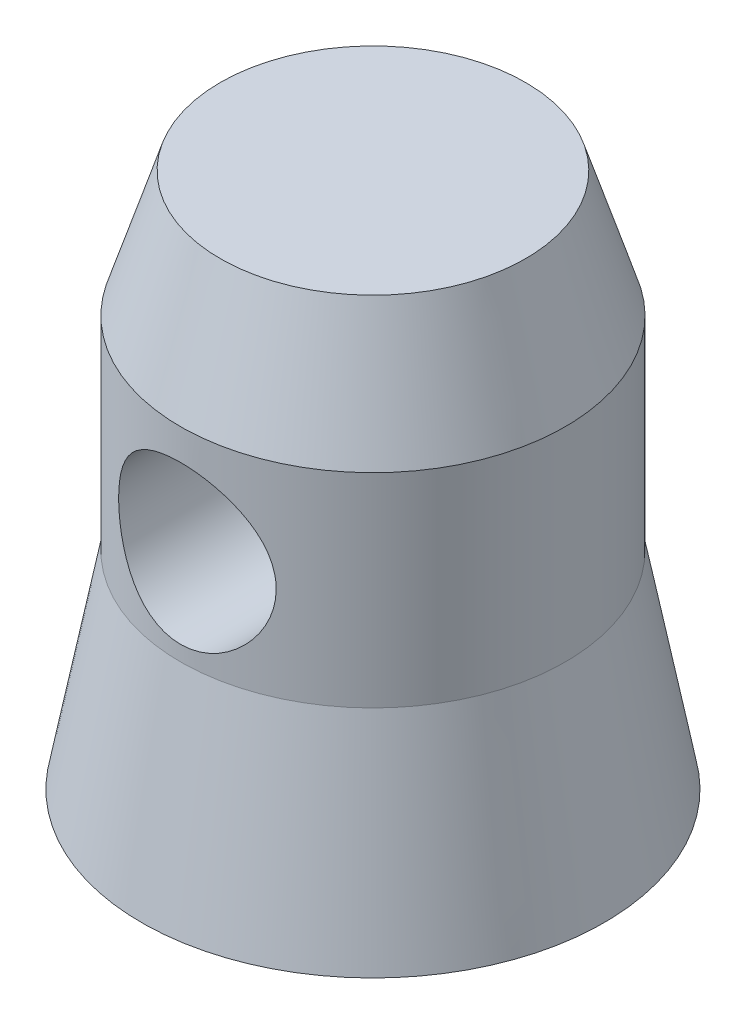
ISO-10303-21;
HEADER;
FILE_DESCRIPTION(('STEP AP214'),'2;1');
FILE_NAME('part.step','',(''),(''),'','','');
FILE_SCHEMA(('AUTOMOTIVE_DESIGN { 1 0 10303 214 1 1 1 1 }'));
ENDSEC;
DATA;
#1=APPLICATION_CONTEXT('core data for automotive mechanical design processes');
#2=APPLICATION_PROTOCOL_DEFINITION('international standard','automotive_design',2000,#1);
#3=PRODUCT_CONTEXT('',#1,'mechanical');
#4=PRODUCT('Part','Part','',(#3));
#5=PRODUCT_RELATED_PRODUCT_CATEGORY('part','',(#4));
#6=PRODUCT_DEFINITION_FORMATION('','',#4);
#7=PRODUCT_DEFINITION_CONTEXT('part definition',#1,'design');
#8=PRODUCT_DEFINITION('design','',#6,#7);
#9=PRODUCT_DEFINITION_SHAPE('','',#8);
#10=(LENGTH_UNIT() NAMED_UNIT(*) SI_UNIT(.MILLI.,.METRE.));
#11=(NAMED_UNIT(*) PLANE_ANGLE_UNIT() SI_UNIT($,.RADIAN.));
#12=(NAMED_UNIT(*) SI_UNIT($,.STERADIAN.) SOLID_ANGLE_UNIT());
#13=UNCERTAINTY_MEASURE_WITH_UNIT(LENGTH_MEASURE(1.E-05),#10,'distance_accuracy_value','');
#14=(GEOMETRIC_REPRESENTATION_CONTEXT(3) GLOBAL_UNCERTAINTY_ASSIGNED_CONTEXT((#13)) GLOBAL_UNIT_ASSIGNED_CONTEXT((#10,
#11,#12)) REPRESENTATION_CONTEXT('',''));
#15=CARTESIAN_POINT('',(0.,0.,0.));
#16=DIRECTION('',(0.,0.,1.));
#17=DIRECTION('',(1.,0.,0.));
#18=AXIS2_PLACEMENT_3D('',#15,#16,#17);
#19=CARTESIAN_POINT('',(0.,40.0685,0.));
#20=DIRECTION('',(0.,-1.,0.));
#21=DIRECTION('',(1.,0.,0.));
#22=AXIS2_PLACEMENT_3D('',#19,#20,#21);
#23=PLANE('',#22);
#24=CARTESIAN_POINT('',(0.,40.0685,0.));
#25=DIRECTION('',(0.,1.,0.));
#26=DIRECTION('',(-1.,0.,0.));
#27=AXIS2_PLACEMENT_3D('',#24,#25,#26);
#28=CIRCLE('',#27,11.4173);
#29=CARTESIAN_POINT('',(-11.4173,40.0685,0.));
#30=VERTEX_POINT('',#29);
#31=EDGE_CURVE('E11',#30,#30,#28,.T.);
#32=ORIENTED_EDGE('',*,*,#31,.T.);
#33=EDGE_LOOP('',(#32));
#34=FACE_BOUND('',#33,.T.);
#35=ADVANCED_FACE('F47',(#34),#23,.F.);
#36=CARTESIAN_POINT('',(0.,30.6720447215452,0.));
#37=DIRECTION('',(0.,-1.,0.));
#38=DIRECTION('',(1.,0.,0.));
#39=AXIS2_PLACEMENT_3D('',#36,#37,#38);
#40=CONICAL_SURFACE('',#39,14.3891,0.306314127170361);
#41=ORIENTED_EDGE('',*,*,#31,.F.);
#42=EDGE_LOOP('',(#41));
#43=FACE_BOUND('',#42,.T.);
#44=CARTESIAN_POINT('',(0.,30.6720447215452,0.));
#45=DIRECTION('',(0.,1.,0.));
#46=DIRECTION('',(-1.,0.,0.));
#47=AXIS2_PLACEMENT_3D('',#44,#45,#46);
#48=CIRCLE('',#47,14.3891);
#49=CARTESIAN_POINT('',(-14.3891,30.6720447215452,0.));
#50=VERTEX_POINT('',#49);
#51=EDGE_CURVE('E58',#50,#50,#48,.T.);
#52=ORIENTED_EDGE('',*,*,#51,.T.);
#53=EDGE_LOOP('',(#52));
#54=FACE_BOUND('',#53,.T.);
#55=ADVANCED_FACE('F124',(#43,#54),#40,.T.);
#56=CARTESIAN_POINT('',(0.,40.0685,0.));
#57=DIRECTION('',(0.,1.,0.));
#58=DIRECTION('',(-1.,0.,0.));
#59=AXIS2_PLACEMENT_3D('',#56,#57,#58);
#60=CYLINDRICAL_SURFACE('',#59,14.3891);
#61=CARTESIAN_POINT('',(5.8928,22.4663,-13.1271134287017));
#62=CARTESIAN_POINT('',(5.89279897874006,22.6237977590066,-13.1271144674701));
#63=CARTESIAN_POINT('',(5.88647659392604,22.7813546515966,-13.1299576705593));
#64=CARTESIAN_POINT('',(5.86124986328871,23.0953271641315,-13.1412379308711));
#65=CARTESIAN_POINT('',(5.84233712473644,23.2517419523897,-13.1496787194296));
#66=CARTESIAN_POINT('',(5.79208054789978,23.5625309397312,-13.1718926746865));
#67=CARTESIAN_POINT('',(5.76070983588906,23.7168999769915,-13.1856773674516));
#68=CARTESIAN_POINT('',(5.68585688768558,24.0222063232181,-13.218127386555));
#69=CARTESIAN_POINT('',(5.64236956222136,24.1731421612805,-13.2367947635369));
#70=CARTESIAN_POINT('',(5.54392401418745,24.4698761356427,-13.2783260424639));
#71=CARTESIAN_POINT('',(5.48901755488484,24.6156940999038,-13.301170952964));
#72=CARTESIAN_POINT('',(5.36809429326873,24.9020438153663,-13.3504315796775));
#73=CARTESIAN_POINT('',(5.30207325611212,25.0425735265878,-13.3768486561892));
#74=CARTESIAN_POINT('',(5.08816355167638,25.4548359260035,-13.4603200744783));
#75=CARTESIAN_POINT('',(4.92430031291323,25.7176244855872,-13.5216512402519));
#76=CARTESIAN_POINT('',(4.54842116235066,26.2269807447127,-13.6528303643214));
#77=CARTESIAN_POINT('',(4.33426886665973,26.4718856687491,-13.7229602449378));
#78=CARTESIAN_POINT('',(3.86811196170328,26.9236521172067,-13.8615597586649));
#79=CARTESIAN_POINT('',(3.61609310908583,27.1304992609418,-13.9300287557371));
#80=CARTESIAN_POINT('',(3.20860337444701,27.4118877473419,-14.0275369775021));
#81=CARTESIAN_POINT('',(3.06464820169486,27.5023721853536,-14.059764528099));
#82=CARTESIAN_POINT('',(2.76894612825238,27.6708110297492,-14.1209730859291));
#83=CARTESIAN_POINT('',(2.61720223883541,27.7487702312049,-14.1499553342767));
#84=CARTESIAN_POINT('',(2.30694460953794,27.8914506613595,-14.2038375879663));
#85=CARTESIAN_POINT('',(2.14843172412335,27.9561735549718,-14.2287381066457));
#86=CARTESIAN_POINT('',(1.82576253096758,28.0717474130809,-14.2737280193694));
#87=CARTESIAN_POINT('',(1.66160660410328,28.1225993117382,-14.2938177373924));
#88=CARTESIAN_POINT('',(1.33733712308195,28.2076661870287,-14.3276986878065));
#89=CARTESIAN_POINT('',(1.17743748542428,28.2425911085459,-14.3417565614498));
#90=CARTESIAN_POINT('',(0.854922548216011,28.2990519206722,-14.3645895650561));
#91=CARTESIAN_POINT('',(0.692307418320001,28.3205886445398,-14.3733650237865));
#92=CARTESIAN_POINT('',(0.365695506854969,28.3500263994732,-14.3853801689324));
#93=CARTESIAN_POINT('',(0.201699180130914,28.3579317556633,-14.3886216112438));
#94=CARTESIAN_POINT('',(-0.126393036505877,28.3600276510301,-14.3894798588847));
#95=CARTESIAN_POINT('',(-0.29048892249047,28.354218700074,-14.3870968733177));
#96=CARTESIAN_POINT('',(-0.607777541247382,28.3297036947262,-14.3770823248087));
#97=CARTESIAN_POINT('',(-0.761041562102387,28.3117800407666,-14.3697692321592));
#98=CARTESIAN_POINT('',(-1.06545101062447,28.2640279468903,-14.3504104351718));
#99=CARTESIAN_POINT('',(-1.2165957325397,28.2341956343398,-14.3383631913323));
#100=CARTESIAN_POINT('',(-1.5156399084112,28.1629259765132,-14.309842400858));
#101=CARTESIAN_POINT('',(-1.66354040567466,28.1214924228677,-14.2933703004691));
#102=CARTESIAN_POINT('',(-1.95525491186343,28.0273764672751,-14.256395297471));
#103=CARTESIAN_POINT('',(-2.09906734358139,27.9746897887745,-14.235890862679));
#104=CARTESIAN_POINT('',(-2.38378528701974,27.8576535375889,-14.1910124470272));
#105=CARTESIAN_POINT('',(-2.52461641667137,27.7931430935489,-14.1665857524366));
#106=CARTESIAN_POINT('',(-2.80034789900867,27.6535009625869,-14.1146721811044));
#107=CARTESIAN_POINT('',(-2.93524605906735,27.5783653915035,-14.0871841860465));
#108=CARTESIAN_POINT('',(-3.32987786004749,27.3378314750322,-14.0010863607578));
#109=CARTESIAN_POINT('',(-3.57973273860891,27.157229822858,-13.9388124343545));
#110=CARTESIAN_POINT('',(-4.06373718416454,26.7463331127313,-13.8057807995121));
#111=CARTESIAN_POINT('',(-4.2956428254531,26.5134836202349,-13.7347341532062));
#112=CARTESIAN_POINT('',(-4.61230715497607,26.1376286061915,-13.6303061868417));
#113=CARTESIAN_POINT('',(-4.7127219241535,26.0078138250705,-13.595830613028));
#114=CARTESIAN_POINT('',(-4.90254614795691,25.7399888339733,-13.5285387834214));
#115=CARTESIAN_POINT('',(-4.99195963277403,25.6019816528184,-13.4957219225899));
#116=CARTESIAN_POINT('',(-5.16178459850035,25.3140849434917,-13.4317042783109));
#117=CARTESIAN_POINT('',(-5.24182588928257,25.1639585182669,-13.4005864371167));
#118=CARTESIAN_POINT('',(-5.38884035780674,24.856794635144,-13.342145853835));
#119=CARTESIAN_POINT('',(-5.4558188680402,24.6997600295247,-13.3148215644607));
#120=CARTESIAN_POINT('',(-5.5760732186576,24.379853878295,-13.2649104173362));
#121=CARTESIAN_POINT('',(-5.62935376978751,24.2169843613312,-13.2423219314313));
#122=CARTESIAN_POINT('',(-5.72164932842111,23.886592779194,-13.2027064086404));
#123=CARTESIAN_POINT('',(-5.76066555290651,23.7190711122383,-13.185678897325));
#124=CARTESIAN_POINT('',(-5.82195394018541,23.3914662584902,-13.1587270727792));
#125=CARTESIAN_POINT('',(-5.84512934049359,23.2315830745074,-13.1484214918916));
#126=CARTESIAN_POINT('',(-5.87827753150692,22.9101896485193,-13.1336356302616));
#127=CARTESIAN_POINT('',(-5.88825116257274,22.7486795107374,-13.1291549787326));
#128=CARTESIAN_POINT('',(-5.894875183698,22.4253762182869,-13.1261821691301));
#129=CARTESIAN_POINT('',(-5.89152922253223,22.2635831532613,-13.1276883710151));
#130=CARTESIAN_POINT('',(-5.87156305729931,21.9409870559544,-13.1366306809222));
#131=CARTESIAN_POINT('',(-5.85494322217848,21.7801839962811,-13.1440666241275));
#132=CARTESIAN_POINT('',(-5.81004943780193,21.4706281287923,-13.1639691209823));
#133=CARTESIAN_POINT('',(-5.78255115456426,21.3217402273062,-13.1760998698263));
#134=CARTESIAN_POINT('',(-5.71629730843592,21.0268993652605,-13.2049781837515));
#135=CARTESIAN_POINT('',(-5.67753811560554,20.8809473673322,-13.2217272374484));
#136=CARTESIAN_POINT('',(-5.58913070043093,20.5929619626042,-13.2593408893447));
#137=CARTESIAN_POINT('',(-5.53948455809045,20.4509278131085,-13.2802047013234));
#138=CARTESIAN_POINT('',(-5.42969130138583,20.1715041705872,-13.3254709376194));
#139=CARTESIAN_POINT('',(-5.36954015244679,20.0341164863799,-13.3498747208935));
#140=CARTESIAN_POINT('',(-5.23650570925004,19.7592037393904,-13.4026316028628));
#141=CARTESIAN_POINT('',(-5.16319971530535,19.6219065668573,-13.4311060487853));
#142=CARTESIAN_POINT('',(-5.00619479390646,19.3538668719287,-13.490413420901));
#143=CARTESIAN_POINT('',(-4.92249231278401,19.2231266123344,-13.5212471521412));
#144=CARTESIAN_POINT('',(-4.74522318937274,18.9688766536814,-13.5844731336045));
#145=CARTESIAN_POINT('',(-4.65165464222894,18.8453683580936,-13.6168656841322));
#146=CARTESIAN_POINT('',(-4.45519596624789,18.6062130377939,-13.6824029367633));
#147=CARTESIAN_POINT('',(-4.35230544701814,18.4905663426712,-13.7155476703235));
#148=CARTESIAN_POINT('',(-4.12932310877077,18.2589724272248,-13.7843950404704));
#149=CARTESIAN_POINT('',(-4.00851512705125,18.1437125343416,-13.8200944817895));
#150=CARTESIAN_POINT('',(-3.75742736584696,17.9237588958497,-13.8904618540291));
#151=CARTESIAN_POINT('',(-3.62715057089775,17.8190618455058,-13.9251301051632));
#152=CARTESIAN_POINT('',(-3.35777430844079,17.6208466607573,-13.9925277420118));
#153=CARTESIAN_POINT('',(-3.21867064336072,17.5273339068948,-14.0252561907373));
#154=CARTESIAN_POINT('',(-2.93258735915395,17.3522868156427,-14.0878514324703));
#155=CARTESIAN_POINT('',(-2.78561116899951,17.2707473201361,-14.1177194558178));
#156=CARTESIAN_POINT('',(-2.48438574021267,17.1201497804061,-14.1738327793914));
#157=CARTESIAN_POINT('',(-2.33012389380604,17.0511144527569,-14.2000714660974));
#158=CARTESIAN_POINT('',(-2.01569690067295,16.9263858676603,-14.2481031127985));
#159=CARTESIAN_POINT('',(-1.855534277246,16.8706869819484,-14.2698979476158));
#160=CARTESIAN_POINT('',(-1.53047645693846,16.7731886137106,-14.3084107252352));
#161=CARTESIAN_POINT('',(-1.3655824787735,16.7313855861518,-14.3251299628005));
#162=CARTESIAN_POINT('',(-1.03234627389794,16.6621371085381,-14.3529929349494));
#163=CARTESIAN_POINT('',(-0.864004295477814,16.6346906284193,-14.3641370695371));
#164=CARTESIAN_POINT('',(-0.536810281873367,16.5958488876108,-14.379951807336));
#165=CARTESIAN_POINT('',(-0.378090767768421,16.5834895862737,-14.3850108669896));
#166=CARTESIAN_POINT('',(-0.0600937874123246,16.5716590062336,-14.3898529821406));
#167=CARTESIAN_POINT('',(0.0991836565164839,16.572187217669,-14.3896362463614));
#168=CARTESIAN_POINT('',(0.417052134245705,16.5861243550575,-14.3839331507322));
#169=CARTESIAN_POINT('',(0.575643270174842,16.5995312933462,-14.3784476040549));
#170=CARTESIAN_POINT('',(0.890964897994285,16.6390776069023,-14.3623571119075));
#171=CARTESIAN_POINT('',(1.04769539941291,16.6652169169382,-14.3517521926653));
#172=CARTESIAN_POINT('',(1.35291988388054,16.7288631665642,-14.326146415148));
#173=CARTESIAN_POINT('',(1.50151356821077,16.7659580549584,-14.3113054620701));
#174=CARTESIAN_POINT('',(1.79497709534298,16.8514523015618,-14.2774675886987));
#175=CARTESIAN_POINT('',(1.93984569798198,16.8998553717833,-14.2584693038536));
#176=CARTESIAN_POINT('',(2.22489359576222,17.0075319782358,-14.2167785767382));
#177=CARTESIAN_POINT('',(2.36507390708796,17.066803140521,-14.1940869413375));
#178=CARTESIAN_POINT('',(2.64003589999877,17.1957807777726,-14.1455261658417));
#179=CARTESIAN_POINT('',(2.77481550158297,17.2654912252248,-14.1196558168188));
#180=CARTESIAN_POINT('',(3.04407024630984,17.4181585209749,-14.0641231993747));
#181=CARTESIAN_POINT('',(3.17826536697984,17.5015665475037,-14.0343434716007));
#182=CARTESIAN_POINT('',(3.43924781556282,17.6786549403873,-13.9726791213882));
#183=CARTESIAN_POINT('',(3.56603256443059,17.7723388508278,-13.9407937742535));
#184=CARTESIAN_POINT('',(3.8115076473749,17.9693815512226,-13.8756886718278));
#185=CARTESIAN_POINT('',(3.9301968828755,18.0727416497558,-13.8424687363988));
#186=CARTESIAN_POINT('',(4.1588576194439,18.2885361291012,-13.7754962954337));
#187=CARTESIAN_POINT('',(4.26882882521347,18.4009708170288,-13.7417437719042));
#188=CARTESIAN_POINT('',(4.48639101046234,18.6419777934361,-13.6723214783539));
#189=CARTESIAN_POINT('',(4.59335254659409,18.7711248660925,-13.6366711944123));
#190=CARTESIAN_POINT('',(4.7960060577798,19.0382516809205,-13.5667245538861));
#191=CARTESIAN_POINT('',(4.89170176503533,19.176228474422,-13.5324277514306));
#192=CARTESIAN_POINT('',(5.07128653853164,19.4604020650839,-13.4661584952345));
#193=CARTESIAN_POINT('',(5.1551636599196,19.6066069724188,-13.4341884086191));
#194=CARTESIAN_POINT('',(5.31029273994916,19.9061600310143,-13.3736279437617));
#195=CARTESIAN_POINT('',(5.38155043710141,20.0595048952051,-13.34503603132));
#196=CARTESIAN_POINT('',(5.51040039436107,20.3713425824934,-13.2923475204956));
#197=CARTESIAN_POINT('',(5.56808175203269,20.5297936118153,-13.2682218482917));
#198=CARTESIAN_POINT('',(5.66977797382079,20.8516268440425,-13.2250849296009));
#199=CARTESIAN_POINT('',(5.71379949724637,21.0150066013823,-13.2060711915995));
#200=CARTESIAN_POINT('',(5.78760876916713,21.3450507993446,-13.1738909600977));
#201=CARTESIAN_POINT('',(5.81743415609117,21.5117053205625,-13.1607090113141));
#202=CARTESIAN_POINT('',(5.86263481951639,21.8472504592646,-13.1406366570643));
#203=CARTESIAN_POINT('',(5.87802143548286,22.0161392162005,-13.1337413145434));
#204=CARTESIAN_POINT('',(5.88833299385925,22.2321539294826,-13.1291177883749));
#205=CARTESIAN_POINT('',(5.89000768833123,22.2789625929936,-13.128366597292));
#206=CARTESIAN_POINT('',(5.89224134657752,22.372612426996,-13.1273642614929));
#207=CARTESIAN_POINT('',(5.8928003037653,22.4194535976775,-13.1271131197286));
#208=CARTESIAN_POINT('',(5.8928,22.4663,-13.1271134287017));
#209=B_SPLINE_CURVE_WITH_KNOTS('',3,(#61,#62,#63,#64,#65,#66,#67,#68,#69,#70,#71,#72,#73,#74,
#75,#76,#77,#78,#79,#80,#81,#82,#83,#84,#85,#86,#87,#88,#89,#90,#91,#92,#93,#94,#95,#96,#97,#98,
#99,#100,#101,#102,#103,#104,#105,#106,#107,#108,#109,#110,#111,#112,#113,#114,#115,#116,#117,
#118,#119,#120,#121,#122,#123,#124,#125,#126,#127,#128,#129,#130,#131,#132,#133,#134,#135,#136,
#137,#138,#139,#140,#141,#142,#143,#144,#145,#146,#147,#148,#149,#150,#151,#152,#153,#154,#155,
#156,#157,#158,#159,#160,#161,#162,#163,#164,#165,#166,#167,#168,#169,#170,#171,#172,#173,#174,
#175,#176,#177,#178,#179,#180,#181,#182,#183,#184,#185,#186,#187,#188,#189,#190,#191,#192,#193,
#194,#195,#196,#197,#198,#199,#200,#201,#202,#203,#204,#205,#206,#207,#208),.UNSPECIFIED.,.T.,
.F.,(4,2,2,2,2,2,2,2,2,2,2,2,2,2,2,2,2,2,2,2,2,2,2,2,2,2,2,2,2,2,2,2,2,2,2,2,2,2,2,2,2,2,2,2,2,
2,2,2,2,2,2,2,2,2,2,2,2,2,2,2,2,2,2,2,2,2,2,2,2,2,2,2,2,4),(0.,0.472444266950458,
0.945203780993147,1.41898869691307,1.89297291476015,2.3648536343754,2.83691455718319,
3.77982826199668,4.77409273358314,5.76873213433177,6.28736019160087,6.80578922546094,
7.3241530091735,7.84248187437296,8.33465922168688,8.8268059336553,9.31879646264159,
9.81076870081658,10.2736692891879,10.7367205332132,11.199620614618,11.6626969271185,
12.1326176495582,12.6027106042108,13.5422993844652,14.5461696229486,15.0488050412728,
15.5512557732816,16.0694617654615,16.587455770633,17.1052713979796,17.6230428368202,
18.1080537232633,18.5930337347778,19.0778808998038,19.5627145890083,20.0178698813722,
20.4731720555524,20.9283873177454,21.3837777968939,21.857944321366,22.3322733710947,
22.8066941684592,23.2811348431629,23.7927732434907,24.304251070821,24.8159739785347,
25.3274757835527,25.8398977222151,26.3521030251618,26.8641775567181,27.3762153425383,
27.8534565766906,28.3306789300423,28.8078276421463,29.2849739097145,29.7460666650567,
30.2073109914392,30.6684546867743,31.1297743102275,31.6116067770604,32.0936059504507,
32.575670402409,33.0577511759462,33.571458020331,34.0849941994984,34.5990457345545,
35.1128629080932,35.623207667964,36.1333032372254,36.6420387433847,37.1503743797451,
37.2908981795228,37.4314228088515),.UNSPECIFIED.);
#210=CARTESIAN_POINT('',(5.8928,22.4663,-13.1271134287017));
#211=VERTEX_POINT('',#210);
#212=EDGE_CURVE('E50',#211,#211,#209,.T.);
#213=ORIENTED_EDGE('',*,*,#212,.T.);
#214=EDGE_LOOP('',(#213));
#215=FACE_BOUND('',#214,.T.);
#216=CARTESIAN_POINT('',(5.8928,22.4663,13.1271134287017));
#217=CARTESIAN_POINT('',(5.89279897874006,22.3088022409934,13.1271144674701));
#218=CARTESIAN_POINT('',(5.88647659392604,22.1512453484034,13.1299576705593));
#219=CARTESIAN_POINT('',(5.86124986328871,21.8372728358685,13.1412379308711));
#220=CARTESIAN_POINT('',(5.84233712473644,21.6808580476103,13.1496787194296));
#221=CARTESIAN_POINT('',(5.79208054789978,21.3700690602688,13.1718926746865));
#222=CARTESIAN_POINT('',(5.76070983588906,21.2157000230085,13.1856773674516));
#223=CARTESIAN_POINT('',(5.68585688768558,20.9103936767819,13.218127386555));
#224=CARTESIAN_POINT('',(5.64236956222136,20.7594578387195,13.2367947635369));
#225=CARTESIAN_POINT('',(5.54392401418745,20.4627238643573,13.2783260424639));
#226=CARTESIAN_POINT('',(5.48901755488484,20.3169059000962,13.301170952964));
#227=CARTESIAN_POINT('',(5.36809429326873,20.0305561846337,13.3504315796775));
#228=CARTESIAN_POINT('',(5.30207325611212,19.8900264734122,13.3768486561892));
#229=CARTESIAN_POINT('',(5.08816355167638,19.4777640739965,13.4603200744783));
#230=CARTESIAN_POINT('',(4.92430031291323,19.2149755144127,13.5216512402519));
#231=CARTESIAN_POINT('',(4.54842116235066,18.7056192552873,13.6528303643214));
#232=CARTESIAN_POINT('',(4.33426886665973,18.4607143312509,13.7229602449378));
#233=CARTESIAN_POINT('',(3.86811196170328,18.0089478827933,13.8615597586649));
#234=CARTESIAN_POINT('',(3.61609310908583,17.8021007390582,13.9300287557371));
#235=CARTESIAN_POINT('',(3.20860337444701,17.5207122526581,14.0275369775021));
#236=CARTESIAN_POINT('',(3.06464820169486,17.4302278146464,14.059764528099));
#237=CARTESIAN_POINT('',(2.76894612825238,17.2617889702508,14.1209730859291));
#238=CARTESIAN_POINT('',(2.61720223883541,17.1838297687951,14.1499553342767));
#239=CARTESIAN_POINT('',(2.30694460953794,17.0411493386405,14.2038375879663));
#240=CARTESIAN_POINT('',(2.14843172412335,16.9764264450282,14.2287381066457));
#241=CARTESIAN_POINT('',(1.82576253096758,16.8608525869191,14.2737280193694));
#242=CARTESIAN_POINT('',(1.66160660410328,16.8100006882618,14.2938177373924));
#243=CARTESIAN_POINT('',(1.33733712308195,16.7249338129713,14.3276986878065));
#244=CARTESIAN_POINT('',(1.17743748542428,16.6900088914541,14.3417565614498));
#245=CARTESIAN_POINT('',(0.854922548216011,16.6335480793278,14.3645895650561));
#246=CARTESIAN_POINT('',(0.692307418320001,16.6120113554601,14.3733650237865));
#247=CARTESIAN_POINT('',(0.365695506854969,16.5825736005268,14.3853801689324));
#248=CARTESIAN_POINT('',(0.201699180130914,16.5746682443367,14.3886216112438));
#249=CARTESIAN_POINT('',(-0.126393036505877,16.5725723489699,14.3894798588847));
#250=CARTESIAN_POINT('',(-0.29048892249047,16.578381299926,14.3870968733177));
#251=CARTESIAN_POINT('',(-0.607777541247381,16.6028963052737,14.3770823248087));
#252=CARTESIAN_POINT('',(-0.761041562102387,16.6208199592334,14.3697692321592));
#253=CARTESIAN_POINT('',(-1.06545101062447,16.6685720531097,14.3504104351718));
#254=CARTESIAN_POINT('',(-1.2165957325397,16.6984043656602,14.3383631913323));
#255=CARTESIAN_POINT('',(-1.5156399084112,16.7696740234868,14.309842400858));
#256=CARTESIAN_POINT('',(-1.66354040567466,16.8111075771323,14.2933703004691));
#257=CARTESIAN_POINT('',(-1.95525491186343,16.9052235327249,14.256395297471));
#258=CARTESIAN_POINT('',(-2.09906734358139,16.9579102112255,14.235890862679));
#259=CARTESIAN_POINT('',(-2.38378528701974,17.0749464624111,14.1910124470272));
#260=CARTESIAN_POINT('',(-2.52461641667136,17.1394569064511,14.1665857524366));
#261=CARTESIAN_POINT('',(-2.80034789900867,17.2790990374131,14.1146721811044));
#262=CARTESIAN_POINT('',(-2.93524605906735,17.3542346084965,14.0871841860465));
#263=CARTESIAN_POINT('',(-3.32987786004749,17.5947685249678,14.0010863607578));
#264=CARTESIAN_POINT('',(-3.57973273860891,17.775370177142,13.9388124343545));
#265=CARTESIAN_POINT('',(-4.06373718416454,18.1862668872686,13.8057807995121));
#266=CARTESIAN_POINT('',(-4.29564282545309,18.4191163797651,13.7347341532062));
#267=CARTESIAN_POINT('',(-4.61230715497607,18.7949713938085,13.6303061868417));
#268=CARTESIAN_POINT('',(-4.7127219241535,18.9247861749295,13.595830613028));
#269=CARTESIAN_POINT('',(-4.90254614795691,19.1926111660267,13.5285387834214));
#270=CARTESIAN_POINT('',(-4.99195963277403,19.3306183471816,13.4957219225899));
#271=CARTESIAN_POINT('',(-5.16178459850034,19.6185150565083,13.4317042783109));
#272=CARTESIAN_POINT('',(-5.24182588928257,19.7686414817331,13.4005864371167));
#273=CARTESIAN_POINT('',(-5.38884035780673,20.075805364856,13.342145853835));
#274=CARTESIAN_POINT('',(-5.4558188680402,20.2328399704753,13.3148215644607));
#275=CARTESIAN_POINT('',(-5.5760732186576,20.552746121705,13.2649104173362));
#276=CARTESIAN_POINT('',(-5.62935376978751,20.7156156386688,13.2423219314313));
#277=CARTESIAN_POINT('',(-5.72164932842111,21.046007220806,13.2027064086404));
#278=CARTESIAN_POINT('',(-5.76066555290651,21.2135288877617,13.185678897325));
#279=CARTESIAN_POINT('',(-5.82195394018541,21.5411337415098,13.1587270727792));
#280=CARTESIAN_POINT('',(-5.84512934049359,21.7010169254925,13.1484214918916));
#281=CARTESIAN_POINT('',(-5.87827753150692,22.0224103514807,13.1336356302616));
#282=CARTESIAN_POINT('',(-5.88825116257274,22.1839204892626,13.1291549787326));
#283=CARTESIAN_POINT('',(-5.894875183698,22.5072237817131,13.1261821691301));
#284=CARTESIAN_POINT('',(-5.89152922253223,22.6690168467387,13.1276883710151));
#285=CARTESIAN_POINT('',(-5.87156305729931,22.9916129440456,13.1366306809222));
#286=CARTESIAN_POINT('',(-5.85494322217848,23.1524160037189,13.1440666241275));
#287=CARTESIAN_POINT('',(-5.81004943780193,23.4619718712077,13.1639691209823));
#288=CARTESIAN_POINT('',(-5.78255115456426,23.6108597726938,13.1760998698263));
#289=CARTESIAN_POINT('',(-5.71629730843592,23.9057006347394,13.2049781837515));
#290=CARTESIAN_POINT('',(-5.67753811560554,24.0516526326678,13.2217272374484));
#291=CARTESIAN_POINT('',(-5.58913070043093,24.3396380373958,13.2593408893447));
#292=CARTESIAN_POINT('',(-5.53948455809045,24.4816721868915,13.2802047013234));
#293=CARTESIAN_POINT('',(-5.42969130138584,24.7610958294128,13.3254709376194));
#294=CARTESIAN_POINT('',(-5.3695401524468,24.89848351362,13.3498747208935));
#295=CARTESIAN_POINT('',(-5.23650570925004,25.1733962606096,13.4026316028628));
#296=CARTESIAN_POINT('',(-5.16319971530535,25.3106934331427,13.4311060487853));
#297=CARTESIAN_POINT('',(-5.00619479390646,25.5787331280713,13.490413420901));
#298=CARTESIAN_POINT('',(-4.92249231278402,25.7094733876656,13.5212471521412));
#299=CARTESIAN_POINT('',(-4.74522318937275,25.9637233463186,13.5844731336045));
#300=CARTESIAN_POINT('',(-4.65165464222895,26.0872316419064,13.6168656841322));
#301=CARTESIAN_POINT('',(-4.45519596624789,26.3263869622061,13.6824029367633));
#302=CARTESIAN_POINT('',(-4.35230544701814,26.4420336573288,13.7155476703235));
#303=CARTESIAN_POINT('',(-4.12932310877077,26.6736275727752,13.7843950404704));
#304=CARTESIAN_POINT('',(-4.00851512705125,26.7888874656584,13.8200944817895));
#305=CARTESIAN_POINT('',(-3.75742736584696,27.0088411041502,13.8904618540291));
#306=CARTESIAN_POINT('',(-3.62715057089775,27.1135381544942,13.9251301051632));
#307=CARTESIAN_POINT('',(-3.35777430844079,27.3117533392427,13.9925277420118));
#308=CARTESIAN_POINT('',(-3.21867064336072,27.4052660931052,14.0252561907373));
#309=CARTESIAN_POINT('',(-2.93258735915395,27.5803131843573,14.0878514324703));
#310=CARTESIAN_POINT('',(-2.78561116899951,27.6618526798639,14.1177194558178));
#311=CARTESIAN_POINT('',(-2.48438574021267,27.8124502195939,14.1738327793914));
#312=CARTESIAN_POINT('',(-2.33012389380603,27.8814855472431,14.2000714660974));
#313=CARTESIAN_POINT('',(-2.01569690067295,28.0062141323397,14.2481031127985));
#314=CARTESIAN_POINT('',(-1.855534277246,28.0619130180516,14.2698979476158));
#315=CARTESIAN_POINT('',(-1.53047645693846,28.1594113862894,14.3084107252352));
#316=CARTESIAN_POINT('',(-1.3655824787735,28.2012144138482,14.3251299628005));
#317=CARTESIAN_POINT('',(-1.03234627389794,28.2704628914619,14.3529929349494));
#318=CARTESIAN_POINT('',(-0.864004295477814,28.2979093715807,14.3641370695371));
#319=CARTESIAN_POINT('',(-0.536810281873366,28.3367511123891,14.379951807336));
#320=CARTESIAN_POINT('',(-0.37809076776842,28.3491104137262,14.3850108669896));
#321=CARTESIAN_POINT('',(-0.0600937874123237,28.3609409937664,14.3898529821406));
#322=CARTESIAN_POINT('',(0.0991836565164848,28.360412782331,14.3896362463614));
#323=CARTESIAN_POINT('',(0.417052134245706,28.3464756449425,14.3839331507322));
#324=CARTESIAN_POINT('',(0.575643270174843,28.3330687066538,14.3784476040549));
#325=CARTESIAN_POINT('',(0.890964897994286,28.2935223930977,14.3623571119075));
#326=CARTESIAN_POINT('',(1.04769539941291,28.2673830830618,14.3517521926653));
#327=CARTESIAN_POINT('',(1.35291988388054,28.2037368334358,14.326146415148));
#328=CARTESIAN_POINT('',(1.50151356821077,28.1666419450416,14.3113054620701));
#329=CARTESIAN_POINT('',(1.79497709534298,28.0811476984382,14.2774675886987));
#330=CARTESIAN_POINT('',(1.93984569798199,28.0327446282167,14.2584693038536));
#331=CARTESIAN_POINT('',(2.22489359576222,27.9250680217642,14.2167785767382));
#332=CARTESIAN_POINT('',(2.36507390708795,27.865796859479,14.1940869413375));
#333=CARTESIAN_POINT('',(2.64003589999877,27.7368192222274,14.1455261658417));
#334=CARTESIAN_POINT('',(2.77481550158297,27.6671087747752,14.1196558168188));
#335=CARTESIAN_POINT('',(3.04407024630984,27.5144414790251,14.0641231993747));
#336=CARTESIAN_POINT('',(3.17826536697984,27.4310334524963,14.0343434716007));
#337=CARTESIAN_POINT('',(3.43924781556282,27.2539450596127,13.9726791213882));
#338=CARTESIAN_POINT('',(3.56603256443059,27.1602611491722,13.9407937742535));
#339=CARTESIAN_POINT('',(3.8115076473749,26.9632184487774,13.8756886718278));
#340=CARTESIAN_POINT('',(3.9301968828755,26.8598583502441,13.8424687363988));
#341=CARTESIAN_POINT('',(4.1588576194439,26.6440638708988,13.7754962954337));
#342=CARTESIAN_POINT('',(4.26882882521347,26.5316291829712,13.7417437719042));
#343=CARTESIAN_POINT('',(4.48639101046234,26.2906222065639,13.6723214783539));
#344=CARTESIAN_POINT('',(4.59335254659409,26.1614751339075,13.6366711944123));
#345=CARTESIAN_POINT('',(4.7960060577798,25.8943483190795,13.5667245538861));
#346=CARTESIAN_POINT('',(4.89170176503533,25.7563715255779,13.5324277514306));
#347=CARTESIAN_POINT('',(5.07128653853164,25.4721979349161,13.4661584952345));
#348=CARTESIAN_POINT('',(5.1551636599196,25.3259930275811,13.4341884086191));
#349=CARTESIAN_POINT('',(5.31029273994916,25.0264399689857,13.3736279437617));
#350=CARTESIAN_POINT('',(5.38155043710141,24.8730951047949,13.34503603132));
#351=CARTESIAN_POINT('',(5.51040039436107,24.5612574175066,13.2923475204956));
#352=CARTESIAN_POINT('',(5.56808175203269,24.4028063881847,13.2682218482917));
#353=CARTESIAN_POINT('',(5.66977797382079,24.0809731559575,13.2250849296009));
#354=CARTESIAN_POINT('',(5.71379949724637,23.9175933986177,13.2060711915995));
#355=CARTESIAN_POINT('',(5.78760876916713,23.5875492006554,13.1738909600977));
#356=CARTESIAN_POINT('',(5.81743415609117,23.4208946794375,13.1607090113141));
#357=CARTESIAN_POINT('',(5.86263481951639,23.0853495407354,13.1406366570643));
#358=CARTESIAN_POINT('',(5.87802143548286,22.9164607837994,13.1337413145434));
#359=CARTESIAN_POINT('',(5.88833299385925,22.7004460705174,13.1291177883749));
#360=CARTESIAN_POINT('',(5.89000768833123,22.6536374070064,13.128366597292));
#361=CARTESIAN_POINT('',(5.89224134657752,22.559987573004,13.1273642614929));
#362=CARTESIAN_POINT('',(5.8928003037653,22.5131464023225,13.1271131197286));
#363=CARTESIAN_POINT('',(5.8928,22.4663,13.1271134287017));
#364=B_SPLINE_CURVE_WITH_KNOTS('',3,(#216,#217,#218,#219,#220,#221,#222,#223,#224,#225,#226,
#227,#228,#229,#230,#231,#232,#233,#234,#235,#236,#237,#238,#239,#240,#241,#242,#243,#244,#245,
#246,#247,#248,#249,#250,#251,#252,#253,#254,#255,#256,#257,#258,#259,#260,#261,#262,#263,#264,
#265,#266,#267,#268,#269,#270,#271,#272,#273,#274,#275,#276,#277,#278,#279,#280,#281,#282,#283,
#284,#285,#286,#287,#288,#289,#290,#291,#292,#293,#294,#295,#296,#297,#298,#299,#300,#301,#302,
#303,#304,#305,#306,#307,#308,#309,#310,#311,#312,#313,#314,#315,#316,#317,#318,#319,#320,#321,
#322,#323,#324,#325,#326,#327,#328,#329,#330,#331,#332,#333,#334,#335,#336,#337,#338,#339,#340,
#341,#342,#343,#344,#345,#346,#347,#348,#349,#350,#351,#352,#353,#354,#355,#356,#357,#358,#359,
#360,#361,#362,#363),.UNSPECIFIED.,.T.,.F.,(4,2,2,2,2,2,2,2,2,2,2,2,2,2,2,2,2,2,2,2,2,2,2,2,2,2,
2,2,2,2,2,2,2,2,2,2,2,2,2,2,2,2,2,2,2,2,2,2,2,2,2,2,2,2,2,2,2,2,2,2,2,2,2,2,2,2,2,2,2,2,2,2,2,
4),(0.,0.472444266950458,0.945203780993147,1.41898869691307,1.89297291476015,2.36485363437541,
2.83691455718319,3.77982826199668,4.77409273358314,5.76873213433178,6.28736019160087,
6.80578922546094,7.3241530091735,7.84248187437297,8.33465922168688,8.8268059336553,
9.3187964626416,9.81076870081658,10.2736692891879,10.7367205332132,11.199620614618,
11.6626969271185,12.1326176495582,12.6027106042108,13.5422993844652,14.5461696229486,
15.0488050412728,15.5512557732816,16.0694617654615,16.587455770633,17.1052713979797,
17.6230428368202,18.1080537232633,18.5930337347778,19.0778808998038,19.5627145890083,
20.0178698813722,20.4731720555524,20.9283873177454,21.3837777968939,21.857944321366,
22.3322733710947,22.8066941684592,23.2811348431629,23.7927732434907,24.3042510708211,
24.8159739785347,25.3274757835527,25.8398977222151,26.3521030251618,26.8641775567181,
27.3762153425383,27.8534565766906,28.3306789300423,28.8078276421463,29.2849739097145,
29.7460666650567,30.2073109914392,30.6684546867743,31.1297743102275,31.6116067770604,
32.0936059504507,32.575670402409,33.0577511759462,33.571458020331,34.0849941994984,
34.5990457345545,35.1128629080932,35.6232076679639,36.1333032372254,36.6420387433847,
37.1503743797451,37.2908981795228,37.4314228088515),.UNSPECIFIED.);
#365=CARTESIAN_POINT('',(5.8928,22.4663,13.1271134287017));
#366=VERTEX_POINT('',#365);
#367=EDGE_CURVE('E72',#366,#366,#364,.T.);
#368=ORIENTED_EDGE('',*,*,#367,.T.);
#369=EDGE_LOOP('',(#368));
#370=FACE_BOUND('',#369,.T.);
#371=ORIENTED_EDGE('',*,*,#51,.F.);
#372=EDGE_LOOP('',(#371));
#373=FACE_BOUND('',#372,.T.);
#374=CARTESIAN_POINT('',(0.,15.4320447215453,0.));
#375=DIRECTION('',(0.,1.,0.));
#376=DIRECTION('',(-1.,0.,0.));
#377=AXIS2_PLACEMENT_3D('',#374,#375,#376);
#378=CIRCLE('',#377,14.3891);
#379=CARTESIAN_POINT('',(-14.3891,15.4320447215453,0.));
#380=VERTEX_POINT('',#379);
#381=EDGE_CURVE('E91',#380,#380,#378,.T.);
#382=ORIENTED_EDGE('',*,*,#381,.T.);
#383=EDGE_LOOP('',(#382));
#384=FACE_BOUND('',#383,.T.);
#385=ADVANCED_FACE('F98',(#215,#370,#373,#384),#60,.T.);
#386=CARTESIAN_POINT('',(0.,0.,0.));
#387=DIRECTION('',(0.,-1.,0.));
#388=DIRECTION('',(1.,0.,0.));
#389=AXIS2_PLACEMENT_3D('',#386,#387,#388);
#390=CONICAL_SURFACE('',#389,17.2974,0.186273736160795);
#391=ORIENTED_EDGE('',*,*,#381,.F.);
#392=EDGE_LOOP('',(#391));
#393=FACE_BOUND('',#392,.T.);
#394=CARTESIAN_POINT('',(0.,0.,0.));
#395=DIRECTION('',(0.,1.,0.));
#396=DIRECTION('',(-1.,0.,0.));
#397=AXIS2_PLACEMENT_3D('',#394,#395,#396);
#398=CIRCLE('',#397,17.2974);
#399=CARTESIAN_POINT('',(-17.2974,0.,0.));
#400=VERTEX_POINT('',#399);
#401=EDGE_CURVE('E87',#400,#400,#398,.T.);
#402=ORIENTED_EDGE('',*,*,#401,.T.);
#403=EDGE_LOOP('',(#402));
#404=FACE_BOUND('',#403,.T.);
#405=ADVANCED_FACE('F117',(#393,#404),#390,.T.);
#406=CARTESIAN_POINT('',(10.5974,0.,0.));
#407=DIRECTION('',(0.,1.,0.));
#408=DIRECTION('',(-1.,0.,0.));
#409=AXIS2_PLACEMENT_3D('',#406,#407,#408);
#410=PLANE('',#409);
#411=ORIENTED_EDGE('',*,*,#401,.F.);
#412=EDGE_LOOP('',(#411));
#413=FACE_BOUND('',#412,.T.);
#414=CARTESIAN_POINT('',(0.,0.,0.));
#415=DIRECTION('',(0.,1.,0.));
#416=DIRECTION('',(-1.,0.,0.));
#417=AXIS2_PLACEMENT_3D('',#414,#415,#416);
#418=CIRCLE('',#417,10.5974);
#419=CARTESIAN_POINT('',(-10.5974,0.,0.));
#420=VERTEX_POINT('',#419);
#421=EDGE_CURVE('E83',#420,#420,#418,.T.);
#422=ORIENTED_EDGE('',*,*,#421,.T.);
#423=EDGE_LOOP('',(#422));
#424=FACE_BOUND('',#423,.T.);
#425=ADVANCED_FACE('F114',(#413,#424),#410,.F.);
#426=CARTESIAN_POINT('',(0.,3.31,0.));
#427=DIRECTION('',(0.,-1.,0.));
#428=DIRECTION('',(1.,0.,0.));
#429=AXIS2_PLACEMENT_3D('',#426,#427,#428);
#430=CONICAL_SURFACE('',#429,5.,1.0367643758032);
#431=ORIENTED_EDGE('',*,*,#421,.F.);
#432=EDGE_LOOP('',(#431));
#433=FACE_BOUND('',#432,.T.);
#434=CARTESIAN_POINT('',(0.,3.31,0.));
#435=DIRECTION('',(0.,1.,0.));
#436=DIRECTION('',(-1.,0.,0.));
#437=AXIS2_PLACEMENT_3D('',#434,#435,#436);
#438=CIRCLE('',#437,5.);
#439=CARTESIAN_POINT('',(-5.,3.31,0.));
#440=VERTEX_POINT('',#439);
#441=EDGE_CURVE('E79',#440,#440,#438,.T.);
#442=ORIENTED_EDGE('',*,*,#441,.T.);
#443=EDGE_LOOP('',(#442));
#444=FACE_BOUND('',#443,.T.);
#445=ADVANCED_FACE('F110',(#433,#444),#430,.F.);
#446=CARTESIAN_POINT('',(5.,3.31,0.));
#447=DIRECTION('',(0.,1.,0.));
#448=DIRECTION('',(-1.,0.,0.));
#449=AXIS2_PLACEMENT_3D('',#446,#447,#448);
#450=PLANE('',#449);
#451=CARTESIAN_POINT('',(0.,3.31,0.));
#452=DIRECTION('',(0.,-1.,0.));
#453=DIRECTION('',(0.,0.,-1.));
#454=AXIS2_PLACEMENT_3D('',#451,#452,#453);
#455=CIRCLE('',#454,4.24999999999999);
#456=CARTESIAN_POINT('',(0.,3.31,-4.24999999999999));
#457=VERTEX_POINT('',#456);
#458=EDGE_CURVE('E73',#457,#457,#455,.T.);
#459=ORIENTED_EDGE('',*,*,#458,.F.);
#460=EDGE_LOOP('',(#459));
#461=FACE_BOUND('',#460,.T.);
#462=ORIENTED_EDGE('',*,*,#441,.F.);
#463=EDGE_LOOP('',(#462));
#464=FACE_BOUND('',#463,.T.);
#465=ADVANCED_FACE('F104',(#461,#464),#450,.F.);
#466=CARTESIAN_POINT('',(0.,22.4663,-17.2974));
#467=DIRECTION('',(0.,0.,1.));
#468=DIRECTION('',(1.,0.,0.));
#469=AXIS2_PLACEMENT_3D('',#466,#467,#468);
#470=CYLINDRICAL_SURFACE('',#469,5.8928);
#471=ORIENTED_EDGE('',*,*,#367,.F.);
#472=EDGE_LOOP('',(#471));
#473=FACE_BOUND('',#472,.T.);
#474=ORIENTED_EDGE('',*,*,#212,.F.);
#475=EDGE_LOOP('',(#474));
#476=FACE_BOUND('',#475,.T.);
#477=ADVANCED_FACE('F66',(#473,#476),#470,.F.);
#478=CARTESIAN_POINT('',(0.,12.5556,0.));
#479=DIRECTION('',(0.,-1.,0.));
#480=DIRECTION('',(0.,0.,-1.));
#481=AXIS2_PLACEMENT_3D('',#478,#479,#480);
#482=CONICAL_SURFACE('',#481,4.25,1.02974425867665);
#483=CARTESIAN_POINT('',(0.,15.1092576308671,0.));
#484=VERTEX_POINT('',#483);
#485=VERTEX_LOOP('',#484);
#486=FACE_BOUND('',#485,.T.);
#487=CARTESIAN_POINT('',(0.,12.5556,0.));
#488=DIRECTION('',(0.,-1.,0.));
#489=DIRECTION('',(0.,0.,-1.));
#490=AXIS2_PLACEMENT_3D('',#487,#488,#489);
#491=CIRCLE('',#490,4.25);
#492=CARTESIAN_POINT('',(0.,12.5556,-4.25));
#493=VERTEX_POINT('',#492);
#494=EDGE_CURVE('E70',#493,#493,#491,.T.);
#495=ORIENTED_EDGE('',*,*,#494,.T.);
#496=EDGE_LOOP('',(#495));
#497=FACE_BOUND('',#496,.T.);
#498=ADVANCED_FACE('F62',(#486,#497),#482,.F.);
#499=CARTESIAN_POINT('',(0.,3.31,0.));
#500=DIRECTION('',(0.,-1.,0.));
#501=DIRECTION('',(0.,0.,-1.));
#502=AXIS2_PLACEMENT_3D('',#499,#500,#501);
#503=CYLINDRICAL_SURFACE('',#502,4.24999999999999);
#504=ORIENTED_EDGE('',*,*,#494,.F.);
#505=EDGE_LOOP('',(#504));
#506=FACE_BOUND('',#505,.T.);
#507=ORIENTED_EDGE('',*,*,#458,.T.);
#508=EDGE_LOOP('',(#507));
#509=FACE_BOUND('',#508,.T.);
#510=ADVANCED_FACE('F65',(#506,#509),#503,.F.);
#511=CLOSED_SHELL('',(#35,#55,#385,#405,#425,#445,#465,#477,#498,#510));
#512=MANIFOLD_SOLID_BREP('B2',#511);
#513=ADVANCED_BREP_SHAPE_REPRESENTATION('',(#18,#512),#14);
#514=SHAPE_DEFINITION_REPRESENTATION(#9,#513);
ENDSEC;
END-ISO-10303-21;
